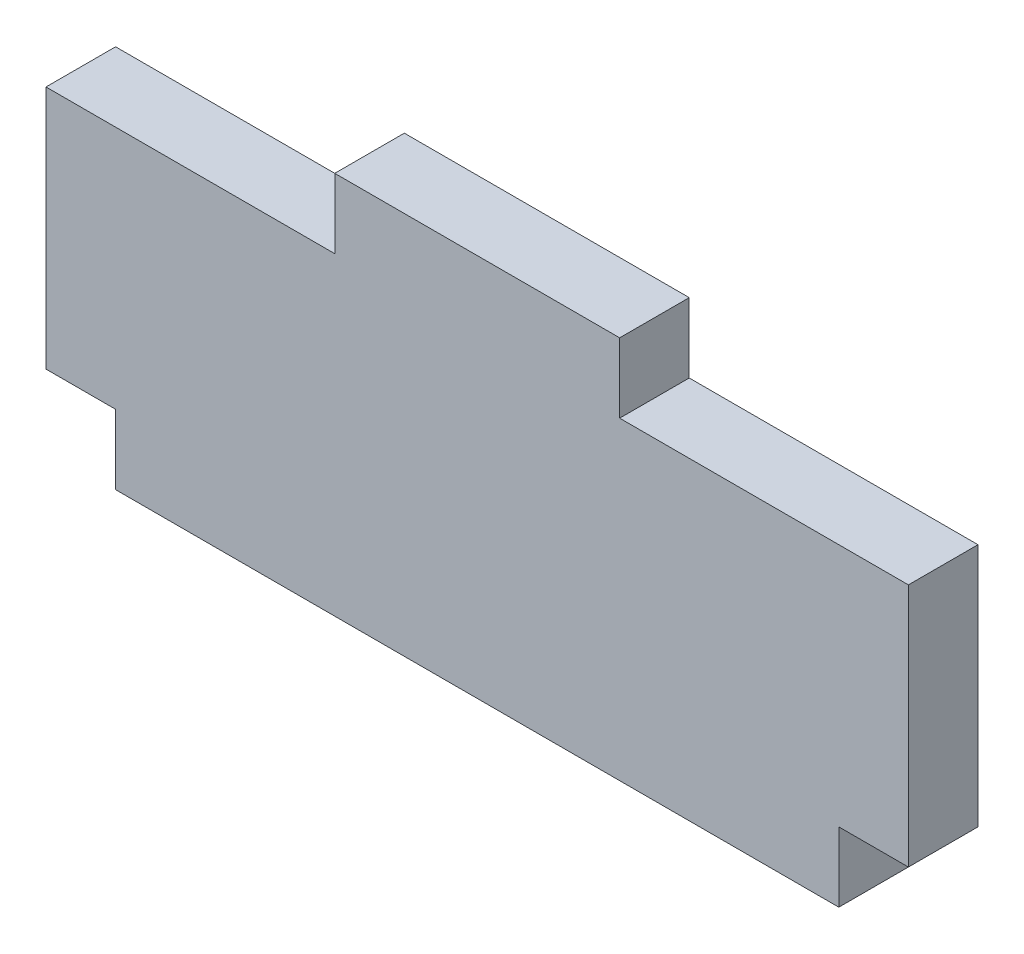
ISO-10303-21;
HEADER;
FILE_DESCRIPTION(('STEP AP214'),'2;1');
FILE_NAME('part.step','',(''),(''),'','','');
FILE_SCHEMA(('AUTOMOTIVE_DESIGN { 1 0 10303 214 1 1 1 1 }'));
ENDSEC;
DATA;
#1=APPLICATION_CONTEXT('core data for automotive mechanical design processes');
#2=APPLICATION_PROTOCOL_DEFINITION('international standard','automotive_design',2000,#1);
#3=PRODUCT_CONTEXT('',#1,'mechanical');
#4=PRODUCT('Part','Part','',(#3));
#5=PRODUCT_RELATED_PRODUCT_CATEGORY('part','',(#4));
#6=PRODUCT_DEFINITION_FORMATION('','',#4);
#7=PRODUCT_DEFINITION_CONTEXT('part definition',#1,'design');
#8=PRODUCT_DEFINITION('design','',#6,#7);
#9=PRODUCT_DEFINITION_SHAPE('','',#8);
#10=(LENGTH_UNIT() NAMED_UNIT(*) SI_UNIT(.MILLI.,.METRE.));
#11=(NAMED_UNIT(*) PLANE_ANGLE_UNIT() SI_UNIT($,.RADIAN.));
#12=(NAMED_UNIT(*) SI_UNIT($,.STERADIAN.) SOLID_ANGLE_UNIT());
#13=UNCERTAINTY_MEASURE_WITH_UNIT(LENGTH_MEASURE(1.E-05),#10,'distance_accuracy_value','');
#14=(GEOMETRIC_REPRESENTATION_CONTEXT(3) GLOBAL_UNCERTAINTY_ASSIGNED_CONTEXT((#13)) GLOBAL_UNIT_ASSIGNED_CONTEXT((#10,
#11,#12)) REPRESENTATION_CONTEXT('',''));
#15=CARTESIAN_POINT('',(0.,0.,0.));
#16=DIRECTION('',(0.,0.,1.));
#17=DIRECTION('',(1.,0.,0.));
#18=AXIS2_PLACEMENT_3D('',#15,#16,#17);
#19=CARTESIAN_POINT('',(0.,0.,6.35));
#20=DIRECTION('',(1.,0.,0.));
#21=DIRECTION('',(0.,0.,-1.));
#22=AXIS2_PLACEMENT_3D('',#19,#20,#21);
#23=PLANE('',#22);
#24=DIRECTION('',(0.,-1.,0.));
#25=VECTOR('',#24,1.);
#26=CARTESIAN_POINT('',(0.,0.,0.));
#27=LINE('',#26,#25);
#28=CARTESIAN_POINT('',(0.,0.,0.));
#29=VERTEX_POINT('',#28);
#30=CARTESIAN_POINT('',(0.,-22.3,0.));
#31=VERTEX_POINT('',#30);
#32=EDGE_CURVE('E153',#29,#31,#27,.T.);
#33=ORIENTED_EDGE('',*,*,#32,.T.);
#34=DIRECTION('',(0.,0.,-1.));
#35=VECTOR('',#34,1.);
#36=CARTESIAN_POINT('',(0.,-22.3,6.35));
#37=LINE('',#36,#35);
#38=CARTESIAN_POINT('',(0.,-22.3,6.35));
#39=VERTEX_POINT('',#38);
#40=EDGE_CURVE('E11',#39,#31,#37,.T.);
#41=ORIENTED_EDGE('',*,*,#40,.F.);
#42=DIRECTION('',(0.,-1.,0.));
#43=VECTOR('',#42,1.);
#44=CARTESIAN_POINT('',(0.,0.,6.35));
#45=LINE('',#44,#43);
#46=CARTESIAN_POINT('',(0.,0.,6.35));
#47=VERTEX_POINT('',#46);
#48=EDGE_CURVE('E175',#47,#39,#45,.T.);
#49=ORIENTED_EDGE('',*,*,#48,.F.);
#50=DIRECTION('',(0.,0.,-1.));
#51=VECTOR('',#50,1.);
#52=CARTESIAN_POINT('',(0.,0.,6.35));
#53=LINE('',#52,#51);
#54=EDGE_CURVE('E149',#47,#29,#53,.T.);
#55=ORIENTED_EDGE('',*,*,#54,.T.);
#56=EDGE_LOOP('',(#33,#41,#49,#55));
#57=FACE_BOUND('',#56,.T.);
#58=ADVANCED_FACE('F33',(#57),#23,.F.);
#59=CARTESIAN_POINT('',(0.,-22.3,6.35));
#60=DIRECTION('',(0.,1.,0.));
#61=DIRECTION('',(0.,0.,1.));
#62=AXIS2_PLACEMENT_3D('',#59,#60,#61);
#63=PLANE('',#62);
#64=DIRECTION('',(1.,0.,0.));
#65=VECTOR('',#64,1.);
#66=CARTESIAN_POINT('',(0.,-22.3,0.));
#67=LINE('',#66,#65);
#68=CARTESIAN_POINT('',(6.35,-22.3,0.));
#69=VERTEX_POINT('',#68);
#70=EDGE_CURVE('E156',#31,#69,#67,.T.);
#71=ORIENTED_EDGE('',*,*,#70,.T.);
#72=DIRECTION('',(0.,0.,-1.));
#73=VECTOR('',#72,1.);
#74=CARTESIAN_POINT('',(6.35,-22.3,6.35));
#75=LINE('',#74,#73);
#76=CARTESIAN_POINT('',(6.35,-22.3,6.35));
#77=VERTEX_POINT('',#76);
#78=EDGE_CURVE('E41',#77,#69,#75,.T.);
#79=ORIENTED_EDGE('',*,*,#78,.F.);
#80=DIRECTION('',(1.,0.,0.));
#81=VECTOR('',#80,1.);
#82=CARTESIAN_POINT('',(0.,-22.3,6.35));
#83=LINE('',#82,#81);
#84=EDGE_CURVE('E104',#39,#77,#83,.T.);
#85=ORIENTED_EDGE('',*,*,#84,.F.);
#86=ORIENTED_EDGE('',*,*,#40,.T.);
#87=EDGE_LOOP('',(#71,#79,#85,#86));
#88=FACE_BOUND('',#87,.T.);
#89=ADVANCED_FACE('F253',(#88),#63,.F.);
#90=CARTESIAN_POINT('',(6.35,-22.3,6.35));
#91=DIRECTION('',(1.,0.,0.));
#92=DIRECTION('',(0.,0.,-1.));
#93=AXIS2_PLACEMENT_3D('',#90,#91,#92);
#94=PLANE('',#93);
#95=DIRECTION('',(0.,-1.,0.));
#96=VECTOR('',#95,1.);
#97=CARTESIAN_POINT('',(6.35,-22.3,0.));
#98=LINE('',#97,#96);
#99=CARTESIAN_POINT('',(6.35,-28.65,0.));
#100=VERTEX_POINT('',#99);
#101=EDGE_CURVE('E158',#69,#100,#98,.T.);
#102=ORIENTED_EDGE('',*,*,#101,.T.);
#103=DIRECTION('',(0.,0.,-1.));
#104=VECTOR('',#103,1.);
#105=CARTESIAN_POINT('',(6.35,-28.65,6.35));
#106=LINE('',#105,#104);
#107=CARTESIAN_POINT('',(6.35,-28.65,6.35));
#108=VERTEX_POINT('',#107);
#109=EDGE_CURVE('E194',#108,#100,#106,.T.);
#110=ORIENTED_EDGE('',*,*,#109,.F.);
#111=DIRECTION('',(0.,-1.,0.));
#112=VECTOR('',#111,1.);
#113=CARTESIAN_POINT('',(6.35,-22.3,6.35));
#114=LINE('',#113,#112);
#115=EDGE_CURVE('E202',#77,#108,#114,.T.);
#116=ORIENTED_EDGE('',*,*,#115,.F.);
#117=ORIENTED_EDGE('',*,*,#78,.T.);
#118=EDGE_LOOP('',(#102,#110,#116,#117));
#119=FACE_BOUND('',#118,.T.);
#120=ADVANCED_FACE('F200',(#119),#94,.F.);
#121=CARTESIAN_POINT('',(72.35,-28.65,6.35));
#122=DIRECTION('',(0.,1.,0.));
#123=DIRECTION('',(-1.,0.,0.));
#124=AXIS2_PLACEMENT_3D('',#121,#122,#123);
#125=PLANE('',#124);
#126=DIRECTION('',(1.,0.,0.));
#127=VECTOR('',#126,1.);
#128=CARTESIAN_POINT('',(72.35,-28.65,0.));
#129=LINE('',#128,#127);
#130=CARTESIAN_POINT('',(72.35,-28.65,0.));
#131=VERTEX_POINT('',#130);
#132=EDGE_CURVE('E160',#100,#131,#129,.T.);
#133=ORIENTED_EDGE('',*,*,#132,.T.);
#134=DIRECTION('',(0.,0.,-1.));
#135=VECTOR('',#134,1.);
#136=CARTESIAN_POINT('',(72.35,-28.65,6.35));
#137=LINE('',#136,#135);
#138=CARTESIAN_POINT('',(72.35,-28.65,6.35));
#139=VERTEX_POINT('',#138);
#140=EDGE_CURVE('E191',#139,#131,#137,.T.);
#141=ORIENTED_EDGE('',*,*,#140,.F.);
#142=DIRECTION('',(1.,0.,0.));
#143=VECTOR('',#142,1.);
#144=CARTESIAN_POINT('',(72.35,-28.65,6.35));
#145=LINE('',#144,#143);
#146=EDGE_CURVE('E220',#108,#139,#145,.T.);
#147=ORIENTED_EDGE('',*,*,#146,.F.);
#148=ORIENTED_EDGE('',*,*,#109,.T.);
#149=EDGE_LOOP('',(#133,#141,#147,#148));
#150=FACE_BOUND('',#149,.T.);
#151=ADVANCED_FACE('F211',(#150),#125,.F.);
#152=CARTESIAN_POINT('',(72.35,-22.3,6.35));
#153=DIRECTION('',(-1.,0.,0.));
#154=DIRECTION('',(0.,0.,1.));
#155=AXIS2_PLACEMENT_3D('',#152,#153,#154);
#156=PLANE('',#155);
#157=DIRECTION('',(0.,1.,0.));
#158=VECTOR('',#157,1.);
#159=CARTESIAN_POINT('',(72.35,-22.3,0.));
#160=LINE('',#159,#158);
#161=CARTESIAN_POINT('',(72.35,-22.3,0.));
#162=VERTEX_POINT('',#161);
#163=EDGE_CURVE('E162',#131,#162,#160,.T.);
#164=ORIENTED_EDGE('',*,*,#163,.T.);
#165=DIRECTION('',(0.,0.,-1.));
#166=VECTOR('',#165,1.);
#167=CARTESIAN_POINT('',(72.35,-22.3,6.35));
#168=LINE('',#167,#166);
#169=CARTESIAN_POINT('',(72.35,-22.3,6.35));
#170=VERTEX_POINT('',#169);
#171=EDGE_CURVE('E188',#170,#162,#168,.T.);
#172=ORIENTED_EDGE('',*,*,#171,.F.);
#173=DIRECTION('',(0.,1.,0.));
#174=VECTOR('',#173,1.);
#175=CARTESIAN_POINT('',(72.35,-22.3,6.35));
#176=LINE('',#175,#174);
#177=EDGE_CURVE('E217',#139,#170,#176,.T.);
#178=ORIENTED_EDGE('',*,*,#177,.F.);
#179=ORIENTED_EDGE('',*,*,#140,.T.);
#180=EDGE_LOOP('',(#164,#172,#178,#179));
#181=FACE_BOUND('',#180,.T.);
#182=ADVANCED_FACE('F215',(#181),#156,.F.);
#183=CARTESIAN_POINT('',(78.7,-22.3,6.35));
#184=DIRECTION('',(0.,1.,0.));
#185=DIRECTION('',(-1.,0.,0.));
#186=AXIS2_PLACEMENT_3D('',#183,#184,#185);
#187=PLANE('',#186);
#188=DIRECTION('',(1.,0.,0.));
#189=VECTOR('',#188,1.);
#190=CARTESIAN_POINT('',(78.7,-22.3,0.));
#191=LINE('',#190,#189);
#192=CARTESIAN_POINT('',(78.7,-22.3,0.));
#193=VERTEX_POINT('',#192);
#194=EDGE_CURVE('E164',#162,#193,#191,.T.);
#195=ORIENTED_EDGE('',*,*,#194,.T.);
#196=DIRECTION('',(0.,0.,-1.));
#197=VECTOR('',#196,1.);
#198=CARTESIAN_POINT('',(78.7,-22.3,6.35));
#199=LINE('',#198,#197);
#200=CARTESIAN_POINT('',(78.7,-22.3,6.35));
#201=VERTEX_POINT('',#200);
#202=EDGE_CURVE('E185',#201,#193,#199,.T.);
#203=ORIENTED_EDGE('',*,*,#202,.F.);
#204=DIRECTION('',(1.,0.,0.));
#205=VECTOR('',#204,1.);
#206=CARTESIAN_POINT('',(78.7,-22.3,6.35));
#207=LINE('',#206,#205);
#208=EDGE_CURVE('E219',#170,#201,#207,.T.);
#209=ORIENTED_EDGE('',*,*,#208,.F.);
#210=ORIENTED_EDGE('',*,*,#171,.T.);
#211=EDGE_LOOP('',(#195,#203,#209,#210));
#212=FACE_BOUND('',#211,.T.);
#213=ADVANCED_FACE('F266',(#212),#187,.F.);
#214=CARTESIAN_POINT('',(78.7,0.,6.35));
#215=DIRECTION('',(-1.,0.,0.));
#216=DIRECTION('',(0.,0.,1.));
#217=AXIS2_PLACEMENT_3D('',#214,#215,#216);
#218=PLANE('',#217);
#219=DIRECTION('',(0.,1.,0.));
#220=VECTOR('',#219,1.);
#221=CARTESIAN_POINT('',(78.7,0.,0.));
#222=LINE('',#221,#220);
#223=CARTESIAN_POINT('',(78.7,0.,0.));
#224=VERTEX_POINT('',#223);
#225=EDGE_CURVE('E166',#193,#224,#222,.T.);
#226=ORIENTED_EDGE('',*,*,#225,.T.);
#227=DIRECTION('',(0.,0.,-1.));
#228=VECTOR('',#227,1.);
#229=CARTESIAN_POINT('',(78.7,0.,6.35));
#230=LINE('',#229,#228);
#231=CARTESIAN_POINT('',(78.7,0.,6.35));
#232=VERTEX_POINT('',#231);
#233=EDGE_CURVE('E182',#232,#224,#230,.T.);
#234=ORIENTED_EDGE('',*,*,#233,.F.);
#235=DIRECTION('',(0.,1.,0.));
#236=VECTOR('',#235,1.);
#237=CARTESIAN_POINT('',(78.7,0.,6.35));
#238=LINE('',#237,#236);
#239=EDGE_CURVE('E222',#201,#232,#238,.T.);
#240=ORIENTED_EDGE('',*,*,#239,.F.);
#241=ORIENTED_EDGE('',*,*,#202,.T.);
#242=EDGE_LOOP('',(#226,#234,#240,#241));
#243=FACE_BOUND('',#242,.T.);
#244=ADVANCED_FACE('F269',(#243),#218,.F.);
#245=CARTESIAN_POINT('',(52.35,0.,6.35));
#246=DIRECTION('',(0.,-1.,0.));
#247=DIRECTION('',(1.,0.,0.));
#248=AXIS2_PLACEMENT_3D('',#245,#246,#247);
#249=PLANE('',#248);
#250=DIRECTION('',(-1.,0.,0.));
#251=VECTOR('',#250,1.);
#252=CARTESIAN_POINT('',(52.35,0.,0.));
#253=LINE('',#252,#251);
#254=CARTESIAN_POINT('',(52.35,0.,0.));
#255=VERTEX_POINT('',#254);
#256=EDGE_CURVE('E168',#224,#255,#253,.T.);
#257=ORIENTED_EDGE('',*,*,#256,.T.);
#258=DIRECTION('',(0.,0.,-1.));
#259=VECTOR('',#258,1.);
#260=CARTESIAN_POINT('',(52.35,0.,6.35));
#261=LINE('',#260,#259);
#262=CARTESIAN_POINT('',(52.35,0.,6.35));
#263=VERTEX_POINT('',#262);
#264=EDGE_CURVE('E179',#263,#255,#261,.T.);
#265=ORIENTED_EDGE('',*,*,#264,.F.);
#266=DIRECTION('',(-1.,0.,0.));
#267=VECTOR('',#266,1.);
#268=CARTESIAN_POINT('',(52.35,0.,6.35));
#269=LINE('',#268,#267);
#270=EDGE_CURVE('E228',#232,#263,#269,.T.);
#271=ORIENTED_EDGE('',*,*,#270,.F.);
#272=ORIENTED_EDGE('',*,*,#233,.T.);
#273=EDGE_LOOP('',(#257,#265,#271,#272));
#274=FACE_BOUND('',#273,.T.);
#275=ADVANCED_FACE('F234',(#274),#249,.F.);
#276=CARTESIAN_POINT('',(52.35,6.35,6.35));
#277=DIRECTION('',(-1.,0.,0.));
#278=DIRECTION('',(0.,0.,1.));
#279=AXIS2_PLACEMENT_3D('',#276,#277,#278);
#280=PLANE('',#279);
#281=DIRECTION('',(0.,1.,0.));
#282=VECTOR('',#281,1.);
#283=CARTESIAN_POINT('',(52.35,6.35,0.));
#284=LINE('',#283,#282);
#285=CARTESIAN_POINT('',(52.35,6.35,0.));
#286=VERTEX_POINT('',#285);
#287=EDGE_CURVE('E170',#255,#286,#284,.T.);
#288=ORIENTED_EDGE('',*,*,#287,.T.);
#289=DIRECTION('',(0.,0.,-1.));
#290=VECTOR('',#289,1.);
#291=CARTESIAN_POINT('',(52.35,6.35,6.35));
#292=LINE('',#291,#290);
#293=CARTESIAN_POINT('',(52.35,6.35,6.35));
#294=VERTEX_POINT('',#293);
#295=EDGE_CURVE('E144',#294,#286,#292,.T.);
#296=ORIENTED_EDGE('',*,*,#295,.F.);
#297=DIRECTION('',(0.,1.,0.));
#298=VECTOR('',#297,1.);
#299=CARTESIAN_POINT('',(52.35,6.35,6.35));
#300=LINE('',#299,#298);
#301=EDGE_CURVE('E135',#263,#294,#300,.T.);
#302=ORIENTED_EDGE('',*,*,#301,.F.);
#303=ORIENTED_EDGE('',*,*,#264,.T.);
#304=EDGE_LOOP('',(#288,#296,#302,#303));
#305=FACE_BOUND('',#304,.T.);
#306=ADVANCED_FACE('F238',(#305),#280,.F.);
#307=CARTESIAN_POINT('',(26.35,6.35,6.35));
#308=DIRECTION('',(0.,-1.,0.));
#309=DIRECTION('',(0.,0.,-1.));
#310=AXIS2_PLACEMENT_3D('',#307,#308,#309);
#311=PLANE('',#310);
#312=DIRECTION('',(-1.,0.,0.));
#313=VECTOR('',#312,1.);
#314=CARTESIAN_POINT('',(26.35,6.35,0.));
#315=LINE('',#314,#313);
#316=CARTESIAN_POINT('',(26.35,6.35,0.));
#317=VERTEX_POINT('',#316);
#318=EDGE_CURVE('E143',#286,#317,#315,.T.);
#319=ORIENTED_EDGE('',*,*,#318,.T.);
#320=DIRECTION('',(0.,0.,-1.));
#321=VECTOR('',#320,1.);
#322=CARTESIAN_POINT('',(26.35,6.35,6.35));
#323=LINE('',#322,#321);
#324=CARTESIAN_POINT('',(26.35,6.35,6.35));
#325=VERTEX_POINT('',#324);
#326=EDGE_CURVE('E140',#325,#317,#323,.T.);
#327=ORIENTED_EDGE('',*,*,#326,.F.);
#328=DIRECTION('',(-1.,0.,0.));
#329=VECTOR('',#328,1.);
#330=CARTESIAN_POINT('',(26.35,6.35,6.35));
#331=LINE('',#330,#329);
#332=EDGE_CURVE('E129',#294,#325,#331,.T.);
#333=ORIENTED_EDGE('',*,*,#332,.F.);
#334=ORIENTED_EDGE('',*,*,#295,.T.);
#335=EDGE_LOOP('',(#319,#327,#333,#334));
#336=FACE_BOUND('',#335,.T.);
#337=ADVANCED_FACE('F141',(#336),#311,.F.);
#338=CARTESIAN_POINT('',(26.35,0.,6.35));
#339=DIRECTION('',(1.,0.,0.));
#340=DIRECTION('',(0.,0.,-1.));
#341=AXIS2_PLACEMENT_3D('',#338,#339,#340);
#342=PLANE('',#341);
#343=DIRECTION('',(0.,-1.,0.));
#344=VECTOR('',#343,1.);
#345=CARTESIAN_POINT('',(26.35,0.,0.));
#346=LINE('',#345,#344);
#347=CARTESIAN_POINT('',(26.35,0.,0.));
#348=VERTEX_POINT('',#347);
#349=EDGE_CURVE('E90',#317,#348,#346,.T.);
#350=ORIENTED_EDGE('',*,*,#349,.T.);
#351=DIRECTION('',(0.,0.,-1.));
#352=VECTOR('',#351,1.);
#353=CARTESIAN_POINT('',(26.35,0.,6.35));
#354=LINE('',#353,#352);
#355=CARTESIAN_POINT('',(26.35,0.,6.35));
#356=VERTEX_POINT('',#355);
#357=EDGE_CURVE('E145',#356,#348,#354,.T.);
#358=ORIENTED_EDGE('',*,*,#357,.F.);
#359=DIRECTION('',(0.,-1.,0.));
#360=VECTOR('',#359,1.);
#361=CARTESIAN_POINT('',(26.35,0.,6.35));
#362=LINE('',#361,#360);
#363=EDGE_CURVE('E133',#325,#356,#362,.T.);
#364=ORIENTED_EDGE('',*,*,#363,.F.);
#365=ORIENTED_EDGE('',*,*,#326,.T.);
#366=EDGE_LOOP('',(#350,#358,#364,#365));
#367=FACE_BOUND('',#366,.T.);
#368=ADVANCED_FACE('F147',(#367),#342,.F.);
#369=CARTESIAN_POINT('',(0.,0.,6.35));
#370=DIRECTION('',(0.,-1.,0.));
#371=DIRECTION('',(0.,0.,-1.));
#372=AXIS2_PLACEMENT_3D('',#369,#370,#371);
#373=PLANE('',#372);
#374=DIRECTION('',(-1.,0.,0.));
#375=VECTOR('',#374,1.);
#376=CARTESIAN_POINT('',(0.,0.,0.));
#377=LINE('',#376,#375);
#378=EDGE_CURVE('E96',#348,#29,#377,.T.);
#379=ORIENTED_EDGE('',*,*,#378,.T.);
#380=ORIENTED_EDGE('',*,*,#54,.F.);
#381=DIRECTION('',(-1.,0.,0.));
#382=VECTOR('',#381,1.);
#383=CARTESIAN_POINT('',(0.,0.,6.35));
#384=LINE('',#383,#382);
#385=EDGE_CURVE('E49',#356,#47,#384,.T.);
#386=ORIENTED_EDGE('',*,*,#385,.F.);
#387=ORIENTED_EDGE('',*,*,#357,.T.);
#388=EDGE_LOOP('',(#379,#380,#386,#387));
#389=FACE_BOUND('',#388,.T.);
#390=ADVANCED_FACE('F242',(#389),#373,.F.);
#391=CARTESIAN_POINT('',(0.,0.,6.35));
#392=DIRECTION('',(0.,0.,1.));
#393=DIRECTION('',(1.,0.,0.));
#394=AXIS2_PLACEMENT_3D('',#391,#392,#393);
#395=PLANE('',#394);
#396=ORIENTED_EDGE('',*,*,#48,.T.);
#397=ORIENTED_EDGE('',*,*,#84,.T.);
#398=ORIENTED_EDGE('',*,*,#115,.T.);
#399=ORIENTED_EDGE('',*,*,#146,.T.);
#400=ORIENTED_EDGE('',*,*,#177,.T.);
#401=ORIENTED_EDGE('',*,*,#208,.T.);
#402=ORIENTED_EDGE('',*,*,#239,.T.);
#403=ORIENTED_EDGE('',*,*,#270,.T.);
#404=ORIENTED_EDGE('',*,*,#301,.T.);
#405=ORIENTED_EDGE('',*,*,#332,.T.);
#406=ORIENTED_EDGE('',*,*,#363,.T.);
#407=ORIENTED_EDGE('',*,*,#385,.T.);
#408=EDGE_LOOP('',(#396,#397,#398,#399,#400,#401,#402,#403,#404,#405,#406,#407));
#409=FACE_BOUND('',#408,.T.);
#410=ADVANCED_FACE('F131',(#409),#395,.T.);
#411=CARTESIAN_POINT('',(0.,0.,0.));
#412=DIRECTION('',(0.,0.,1.));
#413=DIRECTION('',(1.,0.,0.));
#414=AXIS2_PLACEMENT_3D('',#411,#412,#413);
#415=PLANE('',#414);
#416=ORIENTED_EDGE('',*,*,#32,.F.);
#417=ORIENTED_EDGE('',*,*,#378,.F.);
#418=ORIENTED_EDGE('',*,*,#349,.F.);
#419=ORIENTED_EDGE('',*,*,#318,.F.);
#420=ORIENTED_EDGE('',*,*,#287,.F.);
#421=ORIENTED_EDGE('',*,*,#256,.F.);
#422=ORIENTED_EDGE('',*,*,#225,.F.);
#423=ORIENTED_EDGE('',*,*,#194,.F.);
#424=ORIENTED_EDGE('',*,*,#163,.F.);
#425=ORIENTED_EDGE('',*,*,#132,.F.);
#426=ORIENTED_EDGE('',*,*,#101,.F.);
#427=ORIENTED_EDGE('',*,*,#70,.F.);
#428=EDGE_LOOP('',(#416,#417,#418,#419,#420,#421,#422,#423,#424,#425,#426,#427));
#429=FACE_BOUND('',#428,.T.);
#430=ADVANCED_FACE('F206',(#429),#415,.F.);
#431=CLOSED_SHELL('',(#58,#89,#120,#151,#182,#213,#244,#275,#306,#337,#368,#390,#410,#430));
#432=MANIFOLD_SOLID_BREP('B2',#431);
#433=ADVANCED_BREP_SHAPE_REPRESENTATION('',(#18,#432),#14);
#434=SHAPE_DEFINITION_REPRESENTATION(#9,#433);
ENDSEC;
END-ISO-10303-21;
